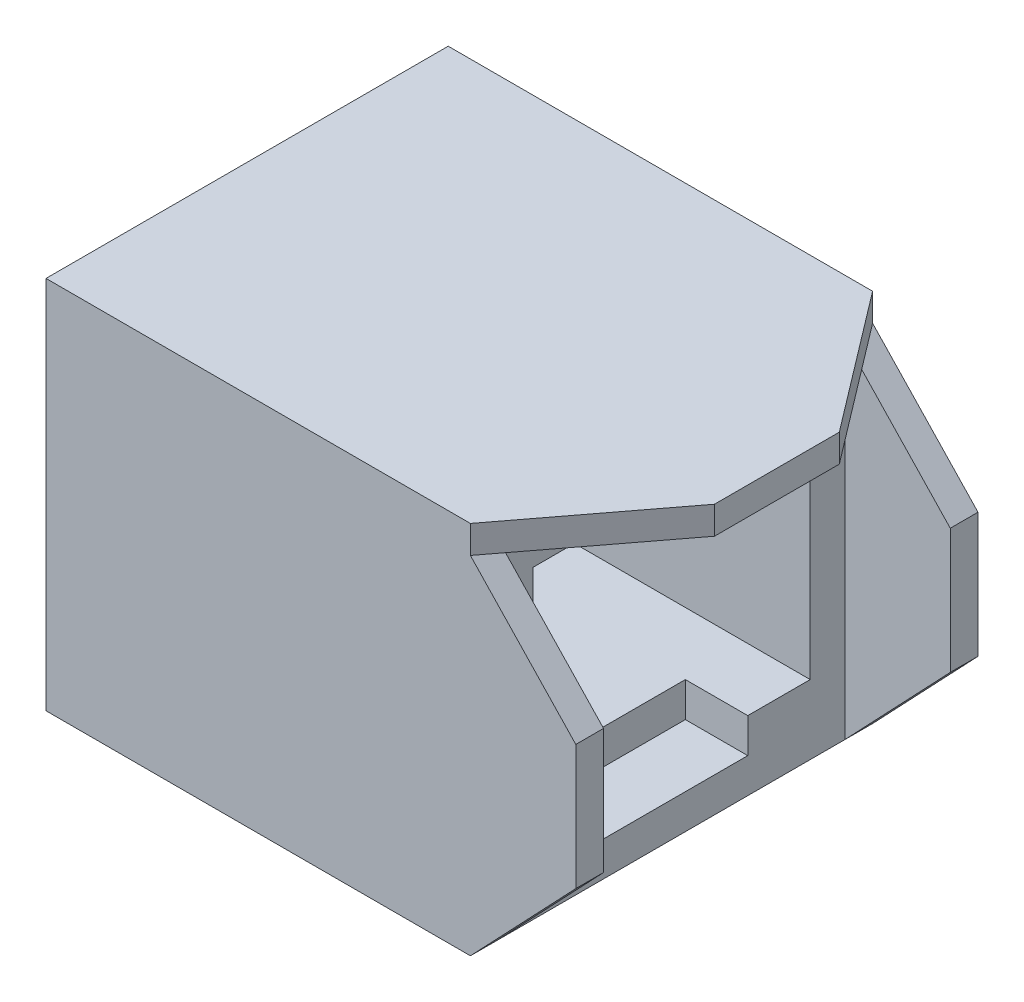
ISO-10303-21;
HEADER;
FILE_DESCRIPTION(('STEP AP214'),'2;1');
FILE_NAME('part.step','',(''),(''),'','','');
FILE_SCHEMA(('AUTOMOTIVE_DESIGN { 1 0 10303 214 1 1 1 1 }'));
ENDSEC;
DATA;
#1=APPLICATION_CONTEXT('core data for automotive mechanical design processes');
#2=APPLICATION_PROTOCOL_DEFINITION('international standard','automotive_design',2000,#1);
#3=PRODUCT_CONTEXT('',#1,'mechanical');
#4=PRODUCT('Part','Part','',(#3));
#5=PRODUCT_RELATED_PRODUCT_CATEGORY('part','',(#4));
#6=PRODUCT_DEFINITION_FORMATION('','',#4);
#7=PRODUCT_DEFINITION_CONTEXT('part definition',#1,'design');
#8=PRODUCT_DEFINITION('design','',#6,#7);
#9=PRODUCT_DEFINITION_SHAPE('','',#8);
#10=(LENGTH_UNIT() NAMED_UNIT(*) SI_UNIT(.MILLI.,.METRE.));
#11=(NAMED_UNIT(*) PLANE_ANGLE_UNIT() SI_UNIT($,.RADIAN.));
#12=(NAMED_UNIT(*) SI_UNIT($,.STERADIAN.) SOLID_ANGLE_UNIT());
#13=UNCERTAINTY_MEASURE_WITH_UNIT(LENGTH_MEASURE(1.E-05),#10,'distance_accuracy_value','');
#14=(GEOMETRIC_REPRESENTATION_CONTEXT(3) GLOBAL_UNCERTAINTY_ASSIGNED_CONTEXT((#13)) GLOBAL_UNIT_ASSIGNED_CONTEXT((#10,
#11,#12)) REPRESENTATION_CONTEXT('',''));
#15=CARTESIAN_POINT('',(0.,0.,0.));
#16=DIRECTION('',(0.,0.,1.));
#17=DIRECTION('',(1.,0.,0.));
#18=AXIS2_PLACEMENT_3D('',#15,#16,#17);
#19=CARTESIAN_POINT('',(28.6,0.,0.));
#20=DIRECTION('',(-1.,0.,0.));
#21=DIRECTION('',(0.,0.,1.));
#22=AXIS2_PLACEMENT_3D('',#19,#20,#21);
#23=PLANE('',#22);
#24=DIRECTION('',(0.,-1.,0.));
#25=VECTOR('',#24,1.);
#26=CARTESIAN_POINT('',(28.6,12.5,-12.5));
#27=LINE('',#26,#25);
#28=CARTESIAN_POINT('',(28.6,12.5,-12.5));
#29=VERTEX_POINT('',#28);
#30=CARTESIAN_POINT('',(28.6,-12.5,-12.5));
#31=VERTEX_POINT('',#30);
#32=EDGE_CURVE('E505',#29,#31,#27,.T.);
#33=ORIENTED_EDGE('',*,*,#32,.F.);
#34=DIRECTION('',(0.,0.,1.));
#35=VECTOR('',#34,1.);
#36=CARTESIAN_POINT('',(28.6,12.5,-12.5));
#37=LINE('',#36,#35);
#38=CARTESIAN_POINT('',(28.6,12.5,12.5));
#39=VERTEX_POINT('',#38);
#40=EDGE_CURVE('E514',#29,#39,#37,.T.);
#41=ORIENTED_EDGE('',*,*,#40,.T.);
#42=DIRECTION('',(0.,-1.,0.));
#43=VECTOR('',#42,1.);
#44=CARTESIAN_POINT('',(28.6,12.5,12.5));
#45=LINE('',#44,#43);
#46=CARTESIAN_POINT('',(28.6,-12.5,12.5));
#47=VERTEX_POINT('',#46);
#48=EDGE_CURVE('E511',#39,#47,#45,.T.);
#49=ORIENTED_EDGE('',*,*,#48,.T.);
#50=DIRECTION('',(0.,0.,1.));
#51=VECTOR('',#50,1.);
#52=CARTESIAN_POINT('',(28.6,-12.5,-12.5));
#53=LINE('',#52,#51);
#54=EDGE_CURVE('E508',#31,#47,#53,.T.);
#55=ORIENTED_EDGE('',*,*,#54,.F.);
#56=EDGE_LOOP('',(#33,#41,#49,#55));
#57=FACE_BOUND('',#56,.T.);
#58=DIRECTION('',(0.,-1.,0.));
#59=VECTOR('',#58,1.);
#60=CARTESIAN_POINT('',(28.6,0.,-5.49999999999999));
#61=LINE('',#60,#59);
#62=CARTESIAN_POINT('',(28.6,-7.5,-5.5));
#63=VERTEX_POINT('',#62);
#64=CARTESIAN_POINT('',(28.6,-10.,-5.5));
#65=VERTEX_POINT('',#64);
#66=EDGE_CURVE('E974',#63,#65,#61,.T.);
#67=ORIENTED_EDGE('',*,*,#66,.T.);
#68=DIRECTION('',(0.,0.,-1.));
#69=VECTOR('',#68,1.);
#70=CARTESIAN_POINT('',(28.6,-10.,0.));
#71=LINE('',#70,#69);
#72=CARTESIAN_POINT('',(28.6,-10.,5.5));
#73=VERTEX_POINT('',#72);
#74=EDGE_CURVE('E973',#73,#65,#71,.T.);
#75=ORIENTED_EDGE('',*,*,#74,.F.);
#76=DIRECTION('',(0.,-1.,0.));
#77=VECTOR('',#76,1.);
#78=CARTESIAN_POINT('',(28.6,0.,5.5));
#79=LINE('',#78,#77);
#80=CARTESIAN_POINT('',(28.6,-7.5,5.5));
#81=VERTEX_POINT('',#80);
#82=EDGE_CURVE('E971',#81,#73,#79,.T.);
#83=ORIENTED_EDGE('',*,*,#82,.F.);
#84=DIRECTION('',(0.,0.,-1.));
#85=VECTOR('',#84,1.);
#86=CARTESIAN_POINT('',(28.6,-7.5,10.));
#87=LINE('',#86,#85);
#88=CARTESIAN_POINT('',(28.6,-7.5,10.));
#89=VERTEX_POINT('',#88);
#90=EDGE_CURVE('E325',#89,#81,#87,.T.);
#91=ORIENTED_EDGE('',*,*,#90,.F.);
#92=DIRECTION('',(0.,-1.,0.));
#93=VECTOR('',#92,1.);
#94=CARTESIAN_POINT('',(28.6,9.5,10.));
#95=LINE('',#94,#93);
#96=CARTESIAN_POINT('',(28.6,9.5,10.));
#97=VERTEX_POINT('',#96);
#98=EDGE_CURVE('E482',#97,#89,#95,.T.);
#99=ORIENTED_EDGE('',*,*,#98,.F.);
#100=DIRECTION('',(0.,0.,-1.));
#101=VECTOR('',#100,1.);
#102=CARTESIAN_POINT('',(28.6,9.5,10.));
#103=LINE('',#102,#101);
#104=CARTESIAN_POINT('',(28.5999999999831,9.5000000000014,2.));
#105=VERTEX_POINT('',#104);
#106=EDGE_CURVE('E490',#97,#105,#103,.T.);
#107=ORIENTED_EDGE('',*,*,#106,.T.);
#108=DIRECTION('',(0.,1.,0.));
#109=VECTOR('',#108,1.);
#110=CARTESIAN_POINT('',(28.6,0.,2.));
#111=LINE('',#110,#109);
#112=CARTESIAN_POINT('',(28.5999999999831,10.5000000000055,2.));
#113=VERTEX_POINT('',#112);
#114=EDGE_CURVE('E362',#105,#113,#111,.T.);
#115=ORIENTED_EDGE('',*,*,#114,.T.);
#116=DIRECTION('',(0.,0.,1.));
#117=VECTOR('',#116,1.);
#118=CARTESIAN_POINT('',(28.6,10.5000000000055,0.));
#119=LINE('',#118,#117);
#120=CARTESIAN_POINT('',(28.5999999999831,10.5000000000055,-2.));
#121=VERTEX_POINT('',#120);
#122=EDGE_CURVE('E365',#121,#113,#119,.T.);
#123=ORIENTED_EDGE('',*,*,#122,.F.);
#124=DIRECTION('',(0.,1.,0.));
#125=VECTOR('',#124,1.);
#126=CARTESIAN_POINT('',(28.6,0.,-2.));
#127=LINE('',#126,#125);
#128=CARTESIAN_POINT('',(28.5999999999831,9.5000000000014,-2.));
#129=VERTEX_POINT('',#128);
#130=EDGE_CURVE('E360',#129,#121,#127,.T.);
#131=ORIENTED_EDGE('',*,*,#130,.F.);
#132=CARTESIAN_POINT('',(28.6,9.5,-10.));
#133=VERTEX_POINT('',#132);
#134=EDGE_CURVE('E489',#129,#133,#103,.T.);
#135=ORIENTED_EDGE('',*,*,#134,.T.);
#136=DIRECTION('',(0.,-1.,0.));
#137=VECTOR('',#136,1.);
#138=CARTESIAN_POINT('',(28.6,9.5,-10.));
#139=LINE('',#138,#137);
#140=CARTESIAN_POINT('',(28.6,-7.5,-10.));
#141=VERTEX_POINT('',#140);
#142=EDGE_CURVE('E486',#133,#141,#139,.T.);
#143=ORIENTED_EDGE('',*,*,#142,.T.);
#144=EDGE_CURVE('E484',#63,#141,#87,.T.);
#145=ORIENTED_EDGE('',*,*,#144,.F.);
#146=EDGE_LOOP('',(#67,#75,#83,#91,#99,#107,#115,#123,#131,#135,#143,#145));
#147=FACE_BOUND('',#146,.T.);
#148=ADVANCED_FACE('F108',(#57,#147),#23,.F.);
#149=CARTESIAN_POINT('',(28.6,-7.5,10.));
#150=DIRECTION('',(0.,1.,0.));
#151=DIRECTION('',(0.,0.,1.));
#152=AXIS2_PLACEMENT_3D('',#149,#150,#151);
#153=PLANE('',#152);
#154=DIRECTION('',(0.,0.,1.));
#155=VECTOR('',#154,1.);
#156=CARTESIAN_POINT('',(24.1,-7.5,0.));
#157=LINE('',#156,#155);
#158=CARTESIAN_POINT('',(24.1,-7.5,-5.5));
#159=VERTEX_POINT('',#158);
#160=CARTESIAN_POINT('',(24.1,-7.5,5.5));
#161=VERTEX_POINT('',#160);
#162=EDGE_CURVE('E314',#159,#161,#157,.T.);
#163=ORIENTED_EDGE('',*,*,#162,.F.);
#164=DIRECTION('',(1.,0.,0.));
#165=VECTOR('',#164,1.);
#166=CARTESIAN_POINT('',(24.1,-7.5,-5.5));
#167=LINE('',#166,#165);
#168=EDGE_CURVE('E326',#159,#63,#167,.T.);
#169=ORIENTED_EDGE('',*,*,#168,.T.);
#170=ORIENTED_EDGE('',*,*,#144,.T.);
#171=DIRECTION('',(-1.,0.,0.));
#172=VECTOR('',#171,1.);
#173=CARTESIAN_POINT('',(28.6,-7.5,-10.));
#174=LINE('',#173,#172);
#175=CARTESIAN_POINT('',(1.1,-7.5,-10.));
#176=VERTEX_POINT('',#175);
#177=EDGE_CURVE('E499',#141,#176,#174,.T.);
#178=ORIENTED_EDGE('',*,*,#177,.T.);
#179=DIRECTION('',(0.,0.,-1.));
#180=VECTOR('',#179,1.);
#181=CARTESIAN_POINT('',(1.1,-7.5,10.));
#182=LINE('',#181,#180);
#183=CARTESIAN_POINT('',(1.1,-7.5,10.));
#184=VERTEX_POINT('',#183);
#185=EDGE_CURVE('E463',#184,#176,#182,.T.);
#186=ORIENTED_EDGE('',*,*,#185,.F.);
#187=DIRECTION('',(-1.,0.,0.));
#188=VECTOR('',#187,1.);
#189=CARTESIAN_POINT('',(28.6,-7.5,10.));
#190=LINE('',#189,#188);
#191=EDGE_CURVE('E502',#89,#184,#190,.T.);
#192=ORIENTED_EDGE('',*,*,#191,.F.);
#193=ORIENTED_EDGE('',*,*,#90,.T.);
#194=DIRECTION('',(1.,0.,0.));
#195=VECTOR('',#194,1.);
#196=CARTESIAN_POINT('',(24.1,-7.5,5.5));
#197=LINE('',#196,#195);
#198=EDGE_CURVE('E309',#161,#81,#197,.T.);
#199=ORIENTED_EDGE('',*,*,#198,.F.);
#200=EDGE_LOOP('',(#163,#169,#170,#178,#186,#192,#193,#199));
#201=FACE_BOUND('',#200,.T.);
#202=ADVANCED_FACE('F322',(#201),#153,.T.);
#203=CARTESIAN_POINT('',(28.6,9.5,10.));
#204=DIRECTION('',(0.,1.,0.));
#205=DIRECTION('',(0.,0.,1.));
#206=AXIS2_PLACEMENT_3D('',#203,#204,#205);
#207=PLANE('',#206);
#208=DIRECTION('',(1.,0.,0.));
#209=VECTOR('',#208,1.);
#210=CARTESIAN_POINT('',(-399982.9,9.49999999994589,-2.));
#211=LINE('',#210,#209);
#212=CARTESIAN_POINT('',(1.10000000000809,9.50000000000139,-2.));
#213=VERTEX_POINT('',#212);
#214=EDGE_CURVE('E339',#213,#129,#211,.T.);
#215=ORIENTED_EDGE('',*,*,#214,.F.);
#216=DIRECTION('',(0.,0.,-1.));
#217=VECTOR('',#216,1.);
#218=CARTESIAN_POINT('',(1.1,9.5,10.));
#219=LINE('',#218,#217);
#220=CARTESIAN_POINT('',(1.1,9.5,-10.));
#221=VERTEX_POINT('',#220);
#222=EDGE_CURVE('E468',#213,#221,#219,.T.);
#223=ORIENTED_EDGE('',*,*,#222,.T.);
#224=DIRECTION('',(-1.,0.,0.));
#225=VECTOR('',#224,1.);
#226=CARTESIAN_POINT('',(28.6,9.5,-10.));
#227=LINE('',#226,#225);
#228=EDGE_CURVE('E496',#133,#221,#227,.T.);
#229=ORIENTED_EDGE('',*,*,#228,.F.);
#230=ORIENTED_EDGE('',*,*,#134,.F.);
#231=EDGE_LOOP('',(#215,#223,#229,#230));
#232=FACE_BOUND('',#231,.T.);
#233=ADVANCED_FACE('F614',(#232),#207,.F.);
#234=CARTESIAN_POINT('',(36.2,0.,0.));
#235=DIRECTION('',(-1.,0.,0.));
#236=DIRECTION('',(0.,0.,1.));
#237=AXIS2_PLACEMENT_3D('',#234,#235,#236);
#238=PLANE('',#237);
#239=DIRECTION('',(0.,-1.,0.));
#240=VECTOR('',#239,1.);
#241=CARTESIAN_POINT('',(36.2,14.5,14.5));
#242=LINE('',#241,#240);
#243=CARTESIAN_POINT('',(36.2,4.5,14.5));
#244=VERTEX_POINT('',#243);
#245=CARTESIAN_POINT('',(36.2,-4.5,14.5));
#246=VERTEX_POINT('',#245);
#247=EDGE_CURVE('E529',#244,#246,#242,.T.);
#248=ORIENTED_EDGE('',*,*,#247,.T.);
#249=DIRECTION('',(0.,0.,1.));
#250=VECTOR('',#249,1.);
#251=CARTESIAN_POINT('',(36.2,-4.5,-14.5));
#252=LINE('',#251,#250);
#253=CARTESIAN_POINT('',(36.2,-4.5,12.5));
#254=VERTEX_POINT('',#253);
#255=EDGE_CURVE('E395',#254,#246,#252,.T.);
#256=ORIENTED_EDGE('',*,*,#255,.F.);
#257=DIRECTION('',(0.,-1.,0.));
#258=VECTOR('',#257,1.);
#259=CARTESIAN_POINT('',(36.2,12.5,12.5));
#260=LINE('',#259,#258);
#261=CARTESIAN_POINT('',(36.2,4.5,12.5));
#262=VERTEX_POINT('',#261);
#263=EDGE_CURVE('E520',#262,#254,#260,.T.);
#264=ORIENTED_EDGE('',*,*,#263,.F.);
#265=DIRECTION('',(0.,0.,1.));
#266=VECTOR('',#265,1.);
#267=CARTESIAN_POINT('',(36.2,4.5,-14.5));
#268=LINE('',#267,#266);
#269=EDGE_CURVE('E418',#262,#244,#268,.T.);
#270=ORIENTED_EDGE('',*,*,#269,.T.);
#271=EDGE_LOOP('',(#248,#256,#264,#270));
#272=FACE_BOUND('',#271,.T.);
#273=ADVANCED_FACE('F563',(#272),#238,.F.);
#274=DIRECTION('',(0.,-1.,0.));
#275=VECTOR('',#274,1.);
#276=CARTESIAN_POINT('',(36.2,12.5,-12.5));
#277=LINE('',#276,#275);
#278=CARTESIAN_POINT('',(36.2,4.5,-12.5));
#279=VERTEX_POINT('',#278);
#280=CARTESIAN_POINT('',(36.2,-4.5,-12.5));
#281=VERTEX_POINT('',#280);
#282=EDGE_CURVE('E517',#279,#281,#277,.T.);
#283=ORIENTED_EDGE('',*,*,#282,.T.);
#284=CARTESIAN_POINT('',(36.2,-4.5,-14.5));
#285=VERTEX_POINT('',#284);
#286=EDGE_CURVE('E409',#285,#281,#252,.T.);
#287=ORIENTED_EDGE('',*,*,#286,.F.);
#288=DIRECTION('',(0.,-1.,0.));
#289=VECTOR('',#288,1.);
#290=CARTESIAN_POINT('',(36.2,14.5,-14.5));
#291=LINE('',#290,#289);
#292=CARTESIAN_POINT('',(36.2,4.5,-14.5));
#293=VERTEX_POINT('',#292);
#294=EDGE_CURVE('E526',#293,#285,#291,.T.);
#295=ORIENTED_EDGE('',*,*,#294,.F.);
#296=EDGE_CURVE('E399',#293,#279,#268,.T.);
#297=ORIENTED_EDGE('',*,*,#296,.T.);
#298=EDGE_LOOP('',(#283,#287,#295,#297));
#299=FACE_BOUND('',#298,.T.);
#300=ADVANCED_FACE('F593',(#299),#238,.F.);
#301=CARTESIAN_POINT('',(36.2,12.5,-12.5));
#302=DIRECTION('',(0.,0.,-1.));
#303=DIRECTION('',(-1.,0.,0.));
#304=AXIS2_PLACEMENT_3D('',#301,#302,#303);
#305=PLANE('',#304);
#306=ORIENTED_EDGE('',*,*,#32,.T.);
#307=DIRECTION('',(0.688749461914693,0.724999433594414,0.));
#308=VECTOR('',#307,1.);
#309=CARTESIAN_POINT('',(44.6888304862024,4.43561103810776,-12.5));
#310=LINE('',#309,#308);
#311=EDGE_CURVE('E427',#31,#281,#310,.T.);
#312=ORIENTED_EDGE('',*,*,#311,.T.);
#313=ORIENTED_EDGE('',*,*,#282,.F.);
#314=DIRECTION('',(-0.688749461914693,0.724999433594414,0.));
#315=VECTOR('',#314,1.);
#316=CARTESIAN_POINT('',(32.2052562417871,8.70499342969776,-12.5));
#317=LINE('',#316,#315);
#318=EDGE_CURVE('E422',#279,#29,#317,.T.);
#319=ORIENTED_EDGE('',*,*,#318,.T.);
#320=EDGE_LOOP('',(#306,#312,#313,#319));
#321=FACE_BOUND('',#320,.T.);
#322=ADVANCED_FACE('F598',(#321),#305,.F.);
#323=CARTESIAN_POINT('',(36.2,12.5,-12.5));
#324=DIRECTION('',(0.,-1.,0.));
#325=DIRECTION('',(0.,0.,-1.));
#326=AXIS2_PLACEMENT_3D('',#323,#324,#325);
#327=PLANE('',#326);
#328=DIRECTION('',(0.605083267533558,0.,0.796162194123103));
#329=VECTOR('',#328,1.);
#330=CARTESIAN_POINT('',(36.2,12.5,-4.5));
#331=LINE('',#330,#329);
#332=CARTESIAN_POINT('',(28.6,12.5,-14.5));
#333=VERTEX_POINT('',#332);
#334=CARTESIAN_POINT('',(36.2,12.5,-4.5));
#335=VERTEX_POINT('',#334);
#336=EDGE_CURVE('E372',#333,#335,#331,.T.);
#337=ORIENTED_EDGE('',*,*,#336,.T.);
#338=DIRECTION('',(0.,0.,1.));
#339=VECTOR('',#338,1.);
#340=CARTESIAN_POINT('',(36.2,12.5,-12.5));
#341=LINE('',#340,#339);
#342=CARTESIAN_POINT('',(36.2,12.5,4.5));
#343=VERTEX_POINT('',#342);
#344=EDGE_CURVE('E523',#335,#343,#341,.T.);
#345=ORIENTED_EDGE('',*,*,#344,.T.);
#346=DIRECTION('',(-0.605083267533558,0.,0.796162194123103));
#347=VECTOR('',#346,1.);
#348=CARTESIAN_POINT('',(36.2,12.5,4.5));
#349=LINE('',#348,#347);
#350=CARTESIAN_POINT('',(28.6,12.5,14.5));
#351=VERTEX_POINT('',#350);
#352=EDGE_CURVE('E367',#343,#351,#349,.T.);
#353=ORIENTED_EDGE('',*,*,#352,.T.);
#354=DIRECTION('',(0.,0.,1.));
#355=VECTOR('',#354,1.);
#356=CARTESIAN_POINT('',(28.6,12.5,-14.5));
#357=LINE('',#356,#355);
#358=EDGE_CURVE('E414',#39,#351,#357,.T.);
#359=ORIENTED_EDGE('',*,*,#358,.F.);
#360=ORIENTED_EDGE('',*,*,#40,.F.);
#361=EDGE_CURVE('E419',#333,#29,#357,.T.);
#362=ORIENTED_EDGE('',*,*,#361,.F.);
#363=EDGE_LOOP('',(#337,#345,#353,#359,#360,#362));
#364=FACE_BOUND('',#363,.T.);
#365=ADVANCED_FACE('F581',(#364),#327,.T.);
#366=CARTESIAN_POINT('',(36.2,12.5,12.5));
#367=DIRECTION('',(0.,0.,-1.));
#368=DIRECTION('',(-1.,0.,0.));
#369=AXIS2_PLACEMENT_3D('',#366,#367,#368);
#370=PLANE('',#369);
#371=DIRECTION('',(0.688749461914693,0.724999433594414,0.));
#372=VECTOR('',#371,1.);
#373=CARTESIAN_POINT('',(44.6888304862024,4.43561103810776,12.5));
#374=LINE('',#373,#372);
#375=EDGE_CURVE('E425',#47,#254,#374,.T.);
#376=ORIENTED_EDGE('',*,*,#375,.F.);
#377=ORIENTED_EDGE('',*,*,#48,.F.);
#378=DIRECTION('',(-0.688749461914693,0.724999433594414,0.));
#379=VECTOR('',#378,1.);
#380=CARTESIAN_POINT('',(32.2052562417871,8.70499342969776,12.5));
#381=LINE('',#380,#379);
#382=EDGE_CURVE('E404',#262,#39,#381,.T.);
#383=ORIENTED_EDGE('',*,*,#382,.F.);
#384=ORIENTED_EDGE('',*,*,#263,.T.);
#385=EDGE_LOOP('',(#376,#377,#383,#384));
#386=FACE_BOUND('',#385,.T.);
#387=ADVANCED_FACE('F573',(#386),#370,.T.);
#388=CARTESIAN_POINT('',(36.2,14.5,-14.5));
#389=DIRECTION('',(0.,0.,-1.));
#390=DIRECTION('',(-1.,0.,0.));
#391=AXIS2_PLACEMENT_3D('',#388,#389,#390);
#392=PLANE('',#391);
#393=DIRECTION('',(0.,1.,0.));
#394=VECTOR('',#393,1.);
#395=CARTESIAN_POINT('',(28.6,-12.501,-14.5));
#396=LINE('',#395,#394);
#397=CARTESIAN_POINT('',(28.6,14.5,-14.5));
#398=VERTEX_POINT('',#397);
#399=EDGE_CURVE('E371',#333,#398,#396,.T.);
#400=ORIENTED_EDGE('',*,*,#399,.F.);
#401=DIRECTION('',(0.688749461914693,-0.724999433594414,0.));
#402=VECTOR('',#401,1.);
#403=CARTESIAN_POINT('',(28.6,12.5,-14.5));
#404=LINE('',#403,#402);
#405=EDGE_CURVE('E411',#333,#293,#404,.T.);
#406=ORIENTED_EDGE('',*,*,#405,.T.);
#407=ORIENTED_EDGE('',*,*,#294,.T.);
#408=DIRECTION('',(-0.688749461914693,-0.724999433594414,0.));
#409=VECTOR('',#408,1.);
#410=CARTESIAN_POINT('',(28.6,-12.5,-14.5));
#411=LINE('',#410,#409);
#412=CARTESIAN_POINT('',(28.6,-12.5,-14.5));
#413=VERTEX_POINT('',#412);
#414=EDGE_CURVE('E388',#285,#413,#411,.T.);
#415=ORIENTED_EDGE('',*,*,#414,.T.);
#416=DIRECTION('',(-1.,0.,0.));
#417=VECTOR('',#416,1.);
#418=CARTESIAN_POINT('',(-2.,-12.5,-14.5));
#419=LINE('',#418,#417);
#420=CARTESIAN_POINT('',(-2.,-12.5,-14.5));
#421=VERTEX_POINT('',#420);
#422=EDGE_CURVE('E391',#413,#421,#419,.T.);
#423=ORIENTED_EDGE('',*,*,#422,.T.);
#424=DIRECTION('',(0.,-1.,0.));
#425=VECTOR('',#424,1.);
#426=CARTESIAN_POINT('',(-2.,14.5,-14.5));
#427=LINE('',#426,#425);
#428=CARTESIAN_POINT('',(-2.,14.5,-14.5));
#429=VERTEX_POINT('',#428);
#430=EDGE_CURVE('E479',#429,#421,#427,.T.);
#431=ORIENTED_EDGE('',*,*,#430,.F.);
#432=DIRECTION('',(-1.,0.,0.));
#433=VECTOR('',#432,1.);
#434=CARTESIAN_POINT('',(36.2,14.5,-14.5));
#435=LINE('',#434,#433);
#436=EDGE_CURVE('E12',#398,#429,#435,.T.);
#437=ORIENTED_EDGE('',*,*,#436,.F.);
#438=EDGE_LOOP('',(#400,#406,#407,#415,#423,#431,#437));
#439=FACE_BOUND('',#438,.T.);
#440=ADVANCED_FACE('F110',(#439),#392,.T.);
#441=CARTESIAN_POINT('',(36.2,14.5,-14.5));
#442=DIRECTION('',(0.,-1.,0.));
#443=DIRECTION('',(0.,0.,-1.));
#444=AXIS2_PLACEMENT_3D('',#441,#442,#443);
#445=PLANE('',#444);
#446=DIRECTION('',(0.,0.,1.));
#447=VECTOR('',#446,1.);
#448=CARTESIAN_POINT('',(36.2,14.5,-14.5));
#449=LINE('',#448,#447);
#450=CARTESIAN_POINT('',(36.2,14.5,-4.5));
#451=VERTEX_POINT('',#450);
#452=CARTESIAN_POINT('',(36.2,14.5,4.5));
#453=VERTEX_POINT('',#452);
#454=EDGE_CURVE('E532',#451,#453,#449,.T.);
#455=ORIENTED_EDGE('',*,*,#454,.F.);
#456=DIRECTION('',(0.605083267533558,0.,0.796162194123102));
#457=VECTOR('',#456,1.);
#458=CARTESIAN_POINT('',(36.2,14.5,-4.5));
#459=LINE('',#458,#457);
#460=EDGE_CURVE('E373',#398,#451,#459,.T.);
#461=ORIENTED_EDGE('',*,*,#460,.F.);
#462=ORIENTED_EDGE('',*,*,#436,.T.);
#463=DIRECTION('',(0.,0.,1.));
#464=VECTOR('',#463,1.);
#465=CARTESIAN_POINT('',(-2.,14.5,-14.5));
#466=LINE('',#465,#464);
#467=CARTESIAN_POINT('',(-2.,14.5,14.5));
#468=VERTEX_POINT('',#467);
#469=EDGE_CURVE('E472',#429,#468,#466,.T.);
#470=ORIENTED_EDGE('',*,*,#469,.T.);
#471=DIRECTION('',(-1.,0.,0.));
#472=VECTOR('',#471,1.);
#473=CARTESIAN_POINT('',(36.2,14.5,14.5));
#474=LINE('',#473,#472);
#475=CARTESIAN_POINT('',(28.6,14.5,14.5));
#476=VERTEX_POINT('',#475);
#477=EDGE_CURVE('E112',#476,#468,#474,.T.);
#478=ORIENTED_EDGE('',*,*,#477,.F.);
#479=DIRECTION('',(-0.605083267533558,0.,0.796162194123102));
#480=VECTOR('',#479,1.);
#481=CARTESIAN_POINT('',(36.2,14.5,4.5));
#482=LINE('',#481,#480);
#483=EDGE_CURVE('E378',#453,#476,#482,.T.);
#484=ORIENTED_EDGE('',*,*,#483,.F.);
#485=EDGE_LOOP('',(#455,#461,#462,#470,#478,#484));
#486=FACE_BOUND('',#485,.T.);
#487=ADVANCED_FACE('F548',(#486),#445,.F.);
#488=CARTESIAN_POINT('',(36.2,14.5,14.5));
#489=DIRECTION('',(0.,0.,-1.));
#490=DIRECTION('',(-1.,0.,0.));
#491=AXIS2_PLACEMENT_3D('',#488,#489,#490);
#492=PLANE('',#491);
#493=DIRECTION('',(0.688749461914693,-0.724999433594414,0.));
#494=VECTOR('',#493,1.);
#495=CARTESIAN_POINT('',(28.6,12.5,14.5));
#496=LINE('',#495,#494);
#497=EDGE_CURVE('E375',#351,#244,#496,.T.);
#498=ORIENTED_EDGE('',*,*,#497,.F.);
#499=DIRECTION('',(0.,1.,0.));
#500=VECTOR('',#499,1.);
#501=CARTESIAN_POINT('',(28.6,-12.501,14.5));
#502=LINE('',#501,#500);
#503=EDGE_CURVE('E382',#351,#476,#502,.T.);
#504=ORIENTED_EDGE('',*,*,#503,.T.);
#505=ORIENTED_EDGE('',*,*,#477,.T.);
#506=DIRECTION('',(0.,-1.,0.));
#507=VECTOR('',#506,1.);
#508=CARTESIAN_POINT('',(-2.,14.5,14.5));
#509=LINE('',#508,#507);
#510=CARTESIAN_POINT('',(-2.,-12.5,14.5));
#511=VERTEX_POINT('',#510);
#512=EDGE_CURVE('E476',#468,#511,#509,.T.);
#513=ORIENTED_EDGE('',*,*,#512,.T.);
#514=DIRECTION('',(-1.,0.,0.));
#515=VECTOR('',#514,1.);
#516=CARTESIAN_POINT('',(-2.,-12.5,14.5));
#517=LINE('',#516,#515);
#518=CARTESIAN_POINT('',(28.6,-12.5,14.5));
#519=VERTEX_POINT('',#518);
#520=EDGE_CURVE('E392',#519,#511,#517,.T.);
#521=ORIENTED_EDGE('',*,*,#520,.F.);
#522=DIRECTION('',(-0.688749461914693,-0.724999433594414,0.));
#523=VECTOR('',#522,1.);
#524=CARTESIAN_POINT('',(28.6,-12.5,14.5));
#525=LINE('',#524,#523);
#526=EDGE_CURVE('E396',#246,#519,#525,.T.);
#527=ORIENTED_EDGE('',*,*,#526,.F.);
#528=ORIENTED_EDGE('',*,*,#247,.F.);
#529=EDGE_LOOP('',(#498,#504,#505,#513,#521,#527,#528));
#530=FACE_BOUND('',#529,.T.);
#531=ADVANCED_FACE('F541',(#530),#492,.F.);
#532=ORIENTED_EDGE('',*,*,#344,.F.);
#533=DIRECTION('',(0.,1.,0.));
#534=VECTOR('',#533,1.);
#535=CARTESIAN_POINT('',(36.2,-12.501,-4.5));
#536=LINE('',#535,#534);
#537=EDGE_CURVE('E368',#335,#451,#536,.T.);
#538=ORIENTED_EDGE('',*,*,#537,.T.);
#539=ORIENTED_EDGE('',*,*,#454,.T.);
#540=DIRECTION('',(0.,1.,0.));
#541=VECTOR('',#540,1.);
#542=CARTESIAN_POINT('',(36.2,-12.501,4.5));
#543=LINE('',#542,#541);
#544=EDGE_CURVE('E380',#343,#453,#543,.T.);
#545=ORIENTED_EDGE('',*,*,#544,.F.);
#546=EDGE_LOOP('',(#532,#538,#539,#545));
#547=FACE_BOUND('',#546,.T.);
#548=ADVANCED_FACE('F586',(#547),#238,.F.);
#549=CARTESIAN_POINT('',(28.6,9.5,10.));
#550=DIRECTION('',(0.,0.,-1.));
#551=DIRECTION('',(-1.,0.,0.));
#552=AXIS2_PLACEMENT_3D('',#549,#550,#551);
#553=PLANE('',#552);
#554=DIRECTION('',(0.,-1.,0.));
#555=VECTOR('',#554,1.);
#556=CARTESIAN_POINT('',(1.1,9.5,10.));
#557=LINE('',#556,#555);
#558=CARTESIAN_POINT('',(1.1,9.5,10.));
#559=VERTEX_POINT('',#558);
#560=EDGE_CURVE('E456',#559,#184,#557,.T.);
#561=ORIENTED_EDGE('',*,*,#560,.F.);
#562=DIRECTION('',(-1.,0.,0.));
#563=VECTOR('',#562,1.);
#564=CARTESIAN_POINT('',(28.6,9.5,10.));
#565=LINE('',#564,#563);
#566=EDGE_CURVE('E493',#97,#559,#565,.T.);
#567=ORIENTED_EDGE('',*,*,#566,.F.);
#568=ORIENTED_EDGE('',*,*,#98,.T.);
#569=ORIENTED_EDGE('',*,*,#191,.T.);
#570=EDGE_LOOP('',(#561,#567,#568,#569));
#571=FACE_BOUND('',#570,.T.);
#572=ADVANCED_FACE('F618',(#571),#553,.T.);
#573=CARTESIAN_POINT('',(28.6,9.5,-10.));
#574=DIRECTION('',(0.,0.,-1.));
#575=DIRECTION('',(-1.,0.,0.));
#576=AXIS2_PLACEMENT_3D('',#573,#574,#575);
#577=PLANE('',#576);
#578=ORIENTED_EDGE('',*,*,#228,.T.);
#579=DIRECTION('',(0.,-1.,0.));
#580=VECTOR('',#579,1.);
#581=CARTESIAN_POINT('',(1.1,9.5,-10.));
#582=LINE('',#581,#580);
#583=EDGE_CURVE('E465',#221,#176,#582,.T.);
#584=ORIENTED_EDGE('',*,*,#583,.T.);
#585=ORIENTED_EDGE('',*,*,#177,.F.);
#586=ORIENTED_EDGE('',*,*,#142,.F.);
#587=EDGE_LOOP('',(#578,#584,#585,#586));
#588=FACE_BOUND('',#587,.T.);
#589=ADVANCED_FACE('F644',(#588),#577,.F.);
#590=CARTESIAN_POINT('',(1.1,9.5,2.));
#591=VERTEX_POINT('',#590);
#592=EDGE_CURVE('E469',#559,#591,#219,.T.);
#593=ORIENTED_EDGE('',*,*,#592,.T.);
#594=DIRECTION('',(1.,0.,0.));
#595=VECTOR('',#594,1.);
#596=CARTESIAN_POINT('',(-399982.9,9.49999999994589,2.));
#597=LINE('',#596,#595);
#598=EDGE_CURVE('E348',#591,#105,#597,.T.);
#599=ORIENTED_EDGE('',*,*,#598,.T.);
#600=ORIENTED_EDGE('',*,*,#106,.F.);
#601=ORIENTED_EDGE('',*,*,#566,.T.);
#602=EDGE_LOOP('',(#593,#599,#600,#601));
#603=FACE_BOUND('',#602,.T.);
#604=ADVANCED_FACE('F651',(#603),#207,.F.);
#605=CARTESIAN_POINT('',(-2.,0.,0.));
#606=DIRECTION('',(1.,0.,0.));
#607=DIRECTION('',(0.,0.,-1.));
#608=AXIS2_PLACEMENT_3D('',#605,#606,#607);
#609=PLANE('',#608);
#610=DIRECTION('',(0.,0.,-1.));
#611=VECTOR('',#610,1.);
#612=CARTESIAN_POINT('',(-2.00000000000955,10.4999999999791,2.));
#613=LINE('',#612,#611);
#614=CARTESIAN_POINT('',(-2.00000000000955,10.4999999999791,2.));
#615=VERTEX_POINT('',#614);
#616=CARTESIAN_POINT('',(-2.,10.5000000000055,-2.));
#617=VERTEX_POINT('',#616);
#618=EDGE_CURVE('E131',#615,#617,#613,.T.);
#619=ORIENTED_EDGE('',*,*,#618,.F.);
#620=DIRECTION('',(0.,-1.,0.));
#621=VECTOR('',#620,1.);
#622=CARTESIAN_POINT('',(-2.00000000000955,-291584.15,2.));
#623=LINE('',#622,#621);
#624=CARTESIAN_POINT('',(-2.00000000000955,9.50000000000273,2.));
#625=VERTEX_POINT('',#624);
#626=EDGE_CURVE('E353',#615,#625,#623,.T.);
#627=ORIENTED_EDGE('',*,*,#626,.T.);
#628=DIRECTION('',(0.,0.,-1.));
#629=VECTOR('',#628,1.);
#630=CARTESIAN_POINT('',(-2.00000000000955,9.50000000000273,2.));
#631=LINE('',#630,#629);
#632=CARTESIAN_POINT('',(-2.00000000000955,9.50000000000273,-2.));
#633=VERTEX_POINT('',#632);
#634=EDGE_CURVE('E356',#625,#633,#631,.T.);
#635=ORIENTED_EDGE('',*,*,#634,.T.);
#636=DIRECTION('',(0.,-1.,0.));
#637=VECTOR('',#636,1.);
#638=CARTESIAN_POINT('',(-2.00000000000955,-291584.15,-2.));
#639=LINE('',#638,#637);
#640=EDGE_CURVE('E345',#617,#633,#639,.T.);
#641=ORIENTED_EDGE('',*,*,#640,.F.);
#642=EDGE_LOOP('',(#619,#627,#635,#641));
#643=FACE_BOUND('',#642,.T.);
#644=ORIENTED_EDGE('',*,*,#430,.T.);
#645=DIRECTION('',(0.,0.,1.));
#646=VECTOR('',#645,1.);
#647=CARTESIAN_POINT('',(-2.,-12.5,-14.5));
#648=LINE('',#647,#646);
#649=EDGE_CURVE('E401',#421,#511,#648,.T.);
#650=ORIENTED_EDGE('',*,*,#649,.T.);
#651=ORIENTED_EDGE('',*,*,#512,.F.);
#652=ORIENTED_EDGE('',*,*,#469,.F.);
#653=EDGE_LOOP('',(#644,#650,#651,#652));
#654=FACE_BOUND('',#653,.T.);
#655=ADVANCED_FACE('F547',(#643,#654),#609,.F.);
#656=CARTESIAN_POINT('',(1.1,0.,0.));
#657=DIRECTION('',(1.,0.,0.));
#658=DIRECTION('',(0.,0.,-1.));
#659=AXIS2_PLACEMENT_3D('',#656,#657,#658);
#660=PLANE('',#659);
#661=DIRECTION('',(0.,1.,0.));
#662=VECTOR('',#661,1.);
#663=CARTESIAN_POINT('',(1.1,-4.,4.));
#664=LINE('',#663,#662);
#665=CARTESIAN_POINT('',(1.1,-4.,4.));
#666=VERTEX_POINT('',#665);
#667=CARTESIAN_POINT('',(1.1,4.,4.));
#668=VERTEX_POINT('',#667);
#669=EDGE_CURVE('E431',#666,#668,#664,.T.);
#670=ORIENTED_EDGE('',*,*,#669,.T.);
#671=DIRECTION('',(0.,0.,-1.));
#672=VECTOR('',#671,1.);
#673=CARTESIAN_POINT('',(1.1,4.,4.));
#674=LINE('',#673,#672);
#675=CARTESIAN_POINT('',(1.1,4.,-4.));
#676=VERTEX_POINT('',#675);
#677=EDGE_CURVE('E434',#668,#676,#674,.T.);
#678=ORIENTED_EDGE('',*,*,#677,.T.);
#679=DIRECTION('',(0.,1.,0.));
#680=VECTOR('',#679,1.);
#681=CARTESIAN_POINT('',(1.1,-4.,-4.));
#682=LINE('',#681,#680);
#683=CARTESIAN_POINT('',(1.1,-4.,-4.));
#684=VERTEX_POINT('',#683);
#685=EDGE_CURVE('E438',#684,#676,#682,.T.);
#686=ORIENTED_EDGE('',*,*,#685,.F.);
#687=DIRECTION('',(0.,0.,-1.));
#688=VECTOR('',#687,1.);
#689=CARTESIAN_POINT('',(1.1,-4.,4.));
#690=LINE('',#689,#688);
#691=EDGE_CURVE('E441',#666,#684,#690,.T.);
#692=ORIENTED_EDGE('',*,*,#691,.F.);
#693=EDGE_LOOP('',(#670,#678,#686,#692));
#694=FACE_BOUND('',#693,.T.);
#695=ORIENTED_EDGE('',*,*,#560,.T.);
#696=ORIENTED_EDGE('',*,*,#185,.T.);
#697=ORIENTED_EDGE('',*,*,#583,.F.);
#698=ORIENTED_EDGE('',*,*,#222,.F.);
#699=EDGE_CURVE('E473',#591,#213,#219,.T.);
#700=ORIENTED_EDGE('',*,*,#699,.F.);
#701=ORIENTED_EDGE('',*,*,#592,.F.);
#702=EDGE_LOOP('',(#695,#696,#697,#698,#700,#701));
#703=FACE_BOUND('',#702,.T.);
#704=ADVANCED_FACE('F668',(#694,#703),#660,.T.);
#705=CARTESIAN_POINT('',(1.1,-4.,4.));
#706=DIRECTION('',(0.,0.,1.));
#707=DIRECTION('',(1.,0.,0.));
#708=AXIS2_PLACEMENT_3D('',#705,#706,#707);
#709=PLANE('',#708);
#710=DIRECTION('',(0.,1.,0.));
#711=VECTOR('',#710,1.);
#712=CARTESIAN_POINT('',(0.,-4.,4.));
#713=LINE('',#712,#711);
#714=CARTESIAN_POINT('',(0.,-4.,4.));
#715=VERTEX_POINT('',#714);
#716=CARTESIAN_POINT('',(0.,4.,4.));
#717=VERTEX_POINT('',#716);
#718=EDGE_CURVE('E430',#715,#717,#713,.T.);
#719=ORIENTED_EDGE('',*,*,#718,.T.);
#720=DIRECTION('',(-1.,0.,0.));
#721=VECTOR('',#720,1.);
#722=CARTESIAN_POINT('',(1.1,4.,4.));
#723=LINE('',#722,#721);
#724=EDGE_CURVE('E443',#668,#717,#723,.T.);
#725=ORIENTED_EDGE('',*,*,#724,.F.);
#726=ORIENTED_EDGE('',*,*,#669,.F.);
#727=DIRECTION('',(-1.,0.,0.));
#728=VECTOR('',#727,1.);
#729=CARTESIAN_POINT('',(1.1,-4.,4.));
#730=LINE('',#729,#728);
#731=EDGE_CURVE('E454',#666,#715,#730,.T.);
#732=ORIENTED_EDGE('',*,*,#731,.T.);
#733=EDGE_LOOP('',(#719,#725,#726,#732));
#734=FACE_BOUND('',#733,.T.);
#735=ADVANCED_FACE('F676',(#734),#709,.F.);
#736=CARTESIAN_POINT('',(1.1,-4.,4.));
#737=DIRECTION('',(0.,1.,0.));
#738=DIRECTION('',(0.,0.,1.));
#739=AXIS2_PLACEMENT_3D('',#736,#737,#738);
#740=PLANE('',#739);
#741=DIRECTION('',(0.,0.,-1.));
#742=VECTOR('',#741,1.);
#743=CARTESIAN_POINT('',(0.,-4.,4.));
#744=LINE('',#743,#742);
#745=CARTESIAN_POINT('',(0.,-4.,-4.));
#746=VERTEX_POINT('',#745);
#747=EDGE_CURVE('E435',#715,#746,#744,.T.);
#748=ORIENTED_EDGE('',*,*,#747,.F.);
#749=ORIENTED_EDGE('',*,*,#731,.F.);
#750=ORIENTED_EDGE('',*,*,#691,.T.);
#751=DIRECTION('',(-1.,0.,0.));
#752=VECTOR('',#751,1.);
#753=CARTESIAN_POINT('',(1.1,-4.,-4.));
#754=LINE('',#753,#752);
#755=EDGE_CURVE('E457',#684,#746,#754,.T.);
#756=ORIENTED_EDGE('',*,*,#755,.T.);
#757=EDGE_LOOP('',(#748,#749,#750,#756));
#758=FACE_BOUND('',#757,.T.);
#759=ADVANCED_FACE('F684',(#758),#740,.T.);
#760=CARTESIAN_POINT('',(1.1,-4.,-4.));
#761=DIRECTION('',(0.,0.,1.));
#762=DIRECTION('',(1.,0.,0.));
#763=AXIS2_PLACEMENT_3D('',#760,#761,#762);
#764=PLANE('',#763);
#765=DIRECTION('',(0.,1.,0.));
#766=VECTOR('',#765,1.);
#767=CARTESIAN_POINT('',(0.,-4.,-4.));
#768=LINE('',#767,#766);
#769=CARTESIAN_POINT('',(0.,4.,-4.));
#770=VERTEX_POINT('',#769);
#771=EDGE_CURVE('E449',#746,#770,#768,.T.);
#772=ORIENTED_EDGE('',*,*,#771,.F.);
#773=ORIENTED_EDGE('',*,*,#755,.F.);
#774=ORIENTED_EDGE('',*,*,#685,.T.);
#775=DIRECTION('',(-1.,0.,0.));
#776=VECTOR('',#775,1.);
#777=CARTESIAN_POINT('',(1.1,4.,-4.));
#778=LINE('',#777,#776);
#779=EDGE_CURVE('E459',#676,#770,#778,.T.);
#780=ORIENTED_EDGE('',*,*,#779,.T.);
#781=EDGE_LOOP('',(#772,#773,#774,#780));
#782=FACE_BOUND('',#781,.T.);
#783=ADVANCED_FACE('F692',(#782),#764,.T.);
#784=CARTESIAN_POINT('',(1.1,4.,4.));
#785=DIRECTION('',(0.,1.,0.));
#786=DIRECTION('',(0.,0.,1.));
#787=AXIS2_PLACEMENT_3D('',#784,#785,#786);
#788=PLANE('',#787);
#789=DIRECTION('',(0.,0.,-1.));
#790=VECTOR('',#789,1.);
#791=CARTESIAN_POINT('',(0.,4.,4.));
#792=LINE('',#791,#790);
#793=EDGE_CURVE('E446',#717,#770,#792,.T.);
#794=ORIENTED_EDGE('',*,*,#793,.T.);
#795=ORIENTED_EDGE('',*,*,#779,.F.);
#796=ORIENTED_EDGE('',*,*,#677,.F.);
#797=ORIENTED_EDGE('',*,*,#724,.T.);
#798=EDGE_LOOP('',(#794,#795,#796,#797));
#799=FACE_BOUND('',#798,.T.);
#800=ADVANCED_FACE('F699',(#799),#788,.F.);
#801=CARTESIAN_POINT('',(0.,0.,0.));
#802=DIRECTION('',(1.,0.,0.));
#803=DIRECTION('',(0.,0.,-1.));
#804=AXIS2_PLACEMENT_3D('',#801,#802,#803);
#805=PLANE('',#804);
#806=ORIENTED_EDGE('',*,*,#793,.F.);
#807=ORIENTED_EDGE('',*,*,#718,.F.);
#808=ORIENTED_EDGE('',*,*,#747,.T.);
#809=ORIENTED_EDGE('',*,*,#771,.T.);
#810=EDGE_LOOP('',(#806,#807,#808,#809));
#811=FACE_BOUND('',#810,.T.);
#812=ADVANCED_FACE('F707',(#811),#805,.T.);
#813=CARTESIAN_POINT('',(28.6,-12.5,-14.5));
#814=DIRECTION('',(-0.724999433594414,0.688749461914693,0.));
#815=DIRECTION('',(-0.688749461914693,-0.724999433594414,0.));
#816=AXIS2_PLACEMENT_3D('',#813,#814,#815);
#817=PLANE('',#816);
#818=DIRECTION('',(0.,0.,1.));
#819=VECTOR('',#818,1.);
#820=CARTESIAN_POINT('',(28.6,-12.5,-14.5));
#821=LINE('',#820,#819);
#822=EDGE_CURVE('E405',#413,#31,#821,.T.);
#823=ORIENTED_EDGE('',*,*,#822,.F.);
#824=ORIENTED_EDGE('',*,*,#414,.F.);
#825=ORIENTED_EDGE('',*,*,#286,.T.);
#826=ORIENTED_EDGE('',*,*,#311,.F.);
#827=EDGE_LOOP('',(#823,#824,#825,#826));
#828=FACE_BOUND('',#827,.T.);
#829=ADVANCED_FACE('F596',(#828),#817,.F.);
#830=CARTESIAN_POINT('',(-2.,-12.5,-14.5));
#831=DIRECTION('',(0.,1.,0.));
#832=DIRECTION('',(0.,0.,1.));
#833=AXIS2_PLACEMENT_3D('',#830,#831,#832);
#834=PLANE('',#833);
#835=CARTESIAN_POINT('',(1.,-12.5,0.));
#836=DIRECTION('',(0.,-1.,0.));
#837=DIRECTION('',(0.,0.,-1.));
#838=AXIS2_PLACEMENT_3D('',#835,#836,#837);
#839=CIRCLE('',#838,0.900000000000014);
#840=CARTESIAN_POINT('',(1.,-12.5,-0.900000000000014));
#841=VERTEX_POINT('',#840);
#842=EDGE_CURVE('E333',#841,#841,#839,.T.);
#843=ORIENTED_EDGE('',*,*,#842,.F.);
#844=EDGE_LOOP('',(#843));
#845=FACE_BOUND('',#844,.T.);
#846=ORIENTED_EDGE('',*,*,#520,.T.);
#847=ORIENTED_EDGE('',*,*,#649,.F.);
#848=ORIENTED_EDGE('',*,*,#422,.F.);
#849=ORIENTED_EDGE('',*,*,#822,.T.);
#850=ORIENTED_EDGE('',*,*,#54,.T.);
#851=EDGE_CURVE('E408',#47,#519,#821,.T.);
#852=ORIENTED_EDGE('',*,*,#851,.T.);
#853=EDGE_LOOP('',(#846,#847,#848,#849,#850,#852));
#854=FACE_BOUND('',#853,.T.);
#855=ADVANCED_FACE('F556',(#845,#854),#834,.F.);
#856=ORIENTED_EDGE('',*,*,#375,.T.);
#857=ORIENTED_EDGE('',*,*,#255,.T.);
#858=ORIENTED_EDGE('',*,*,#526,.T.);
#859=ORIENTED_EDGE('',*,*,#851,.F.);
#860=EDGE_LOOP('',(#856,#857,#858,#859));
#861=FACE_BOUND('',#860,.T.);
#862=ADVANCED_FACE('F601',(#861),#817,.F.);
#863=CARTESIAN_POINT('',(28.6,12.5,-14.5));
#864=DIRECTION('',(-0.724999433594414,-0.688749461914693,0.));
#865=DIRECTION('',(0.688749461914693,-0.724999433594414,0.));
#866=AXIS2_PLACEMENT_3D('',#863,#864,#865);
#867=PLANE('',#866);
#868=ORIENTED_EDGE('',*,*,#296,.F.);
#869=ORIENTED_EDGE('',*,*,#405,.F.);
#870=ORIENTED_EDGE('',*,*,#361,.T.);
#871=ORIENTED_EDGE('',*,*,#318,.F.);
#872=EDGE_LOOP('',(#868,#869,#870,#871));
#873=FACE_BOUND('',#872,.T.);
#874=ADVANCED_FACE('F599',(#873),#867,.F.);
#875=ORIENTED_EDGE('',*,*,#382,.T.);
#876=ORIENTED_EDGE('',*,*,#358,.T.);
#877=ORIENTED_EDGE('',*,*,#497,.T.);
#878=ORIENTED_EDGE('',*,*,#269,.F.);
#879=EDGE_LOOP('',(#875,#876,#877,#878));
#880=FACE_BOUND('',#879,.T.);
#881=ADVANCED_FACE('F567',(#880),#867,.F.);
#882=CARTESIAN_POINT('',(36.2,-12.501,4.5));
#883=DIRECTION('',(-0.796162194123103,0.,-0.605083267533558));
#884=DIRECTION('',(-0.605083267533558,0.,0.796162194123103));
#885=AXIS2_PLACEMENT_3D('',#882,#883,#884);
#886=PLANE('',#885);
#887=ORIENTED_EDGE('',*,*,#544,.T.);
#888=ORIENTED_EDGE('',*,*,#483,.T.);
#889=ORIENTED_EDGE('',*,*,#503,.F.);
#890=ORIENTED_EDGE('',*,*,#352,.F.);
#891=EDGE_LOOP('',(#887,#888,#889,#890));
#892=FACE_BOUND('',#891,.T.);
#893=ADVANCED_FACE('F585',(#892),#886,.F.);
#894=CARTESIAN_POINT('',(36.2,-12.501,-4.5));
#895=DIRECTION('',(-0.796162194123102,0.,0.605083267533558));
#896=DIRECTION('',(0.605083267533558,0.,0.796162194123102));
#897=AXIS2_PLACEMENT_3D('',#894,#895,#896);
#898=PLANE('',#897);
#899=ORIENTED_EDGE('',*,*,#399,.T.);
#900=ORIENTED_EDGE('',*,*,#460,.T.);
#901=ORIENTED_EDGE('',*,*,#537,.F.);
#902=ORIENTED_EDGE('',*,*,#336,.F.);
#903=EDGE_LOOP('',(#899,#900,#901,#902));
#904=FACE_BOUND('',#903,.T.);
#905=ADVANCED_FACE('F588',(#904),#898,.F.);
#906=CARTESIAN_POINT('',(-399982.9,10.4999999999222,2.));
#907=DIRECTION('',(0.,-1.,0.));
#908=DIRECTION('',(1.,0.,0.));
#909=AXIS2_PLACEMENT_3D('',#906,#907,#908);
#910=PLANE('',#909);
#911=ORIENTED_EDGE('',*,*,#122,.T.);
#912=DIRECTION('',(-1.,0.,0.));
#913=VECTOR('',#912,1.);
#914=CARTESIAN_POINT('',(-399982.9,10.4999999999222,2.));
#915=LINE('',#914,#913);
#916=EDGE_CURVE('E351',#113,#615,#915,.T.);
#917=ORIENTED_EDGE('',*,*,#916,.T.);
#918=ORIENTED_EDGE('',*,*,#618,.T.);
#919=DIRECTION('',(-1.,0.,0.));
#920=VECTOR('',#919,1.);
#921=CARTESIAN_POINT('',(-399982.9,10.4999999999222,-2.));
#922=LINE('',#921,#920);
#923=EDGE_CURVE('E343',#121,#617,#922,.T.);
#924=ORIENTED_EDGE('',*,*,#923,.F.);
#925=EDGE_LOOP('',(#911,#917,#918,#924));
#926=FACE_BOUND('',#925,.T.);
#927=ADVANCED_FACE('F884',(#926),#910,.T.);
#928=CARTESIAN_POINT('',(0.,0.,2.));
#929=DIRECTION('',(0.,0.,1.));
#930=DIRECTION('',(1.,0.,0.));
#931=AXIS2_PLACEMENT_3D('',#928,#929,#930);
#932=PLANE('',#931);
#933=ORIENTED_EDGE('',*,*,#598,.F.);
#934=EDGE_CURVE('E349',#625,#591,#597,.T.);
#935=ORIENTED_EDGE('',*,*,#934,.F.);
#936=ORIENTED_EDGE('',*,*,#626,.F.);
#937=ORIENTED_EDGE('',*,*,#916,.F.);
#938=ORIENTED_EDGE('',*,*,#114,.F.);
#939=EDGE_LOOP('',(#933,#935,#936,#937,#938));
#940=FACE_BOUND('',#939,.T.);
#941=ADVANCED_FACE('F880',(#940),#932,.F.);
#942=CARTESIAN_POINT('',(0.,0.,-2.));
#943=DIRECTION('',(0.,0.,1.));
#944=DIRECTION('',(1.,0.,0.));
#945=AXIS2_PLACEMENT_3D('',#942,#943,#944);
#946=PLANE('',#945);
#947=ORIENTED_EDGE('',*,*,#130,.T.);
#948=ORIENTED_EDGE('',*,*,#923,.T.);
#949=ORIENTED_EDGE('',*,*,#640,.T.);
#950=EDGE_CURVE('E340',#633,#213,#211,.T.);
#951=ORIENTED_EDGE('',*,*,#950,.T.);
#952=ORIENTED_EDGE('',*,*,#214,.T.);
#953=EDGE_LOOP('',(#947,#948,#949,#951,#952));
#954=FACE_BOUND('',#953,.T.);
#955=ADVANCED_FACE('F877',(#954),#946,.T.);
#956=CARTESIAN_POINT('',(-399982.9,9.49999999994589,2.));
#957=DIRECTION('',(0.,1.,0.));
#958=DIRECTION('',(-1.,0.,0.));
#959=AXIS2_PLACEMENT_3D('',#956,#957,#958);
#960=PLANE('',#959);
#961=ORIENTED_EDGE('',*,*,#950,.F.);
#962=ORIENTED_EDGE('',*,*,#634,.F.);
#963=ORIENTED_EDGE('',*,*,#934,.T.);
#964=ORIENTED_EDGE('',*,*,#699,.T.);
#965=EDGE_LOOP('',(#961,#962,#963,#964));
#966=FACE_BOUND('',#965,.T.);
#967=ADVANCED_FACE('F875',(#966),#960,.T.);
#968=CARTESIAN_POINT('',(1.,-8.49999999999999,0.));
#969=DIRECTION('',(0.,1.,0.));
#970=DIRECTION('',(0.,0.,1.));
#971=AXIS2_PLACEMENT_3D('',#968,#969,#970);
#972=PLANE('',#971);
#973=CARTESIAN_POINT('',(1.,-8.49999999999999,0.));
#974=DIRECTION('',(0.,-1.,0.));
#975=DIRECTION('',(0.,0.,-1.));
#976=AXIS2_PLACEMENT_3D('',#973,#974,#975);
#977=CIRCLE('',#976,0.900000000000013);
#978=CARTESIAN_POINT('',(1.,-8.49999999999999,-0.900000000000013));
#979=VERTEX_POINT('',#978);
#980=EDGE_CURVE('E336',#979,#979,#977,.T.);
#981=ORIENTED_EDGE('',*,*,#980,.T.);
#982=EDGE_LOOP('',(#981));
#983=FACE_BOUND('',#982,.T.);
#984=ADVANCED_FACE('F871',(#983),#972,.F.);
#985=CARTESIAN_POINT('',(1.,-12.5,0.));
#986=DIRECTION('',(0.,-1.,0.));
#987=DIRECTION('',(0.,0.,-1.));
#988=AXIS2_PLACEMENT_3D('',#985,#986,#987);
#989=CYLINDRICAL_SURFACE('',#988,0.900000000000013);
#990=ORIENTED_EDGE('',*,*,#980,.F.);
#991=EDGE_LOOP('',(#990));
#992=FACE_BOUND('',#991,.T.);
#993=ORIENTED_EDGE('',*,*,#842,.T.);
#994=EDGE_LOOP('',(#993));
#995=FACE_BOUND('',#994,.T.);
#996=ADVANCED_FACE('F838',(#992,#995),#989,.F.);
#997=CARTESIAN_POINT('',(24.1,0.,-5.49999999999999));
#998=DIRECTION('',(0.,0.,1.));
#999=DIRECTION('',(0.,-1.,0.));
#1000=AXIS2_PLACEMENT_3D('',#997,#998,#999);
#1001=PLANE('',#1000);
#1002=ORIENTED_EDGE('',*,*,#66,.F.);
#1003=ORIENTED_EDGE('',*,*,#168,.F.);
#1004=DIRECTION('',(0.,-1.,0.));
#1005=VECTOR('',#1004,1.);
#1006=CARTESIAN_POINT('',(24.1,0.,-5.49999999999999));
#1007=LINE('',#1006,#1005);
#1008=CARTESIAN_POINT('',(24.1,-10.,-5.5));
#1009=VERTEX_POINT('',#1008);
#1010=EDGE_CURVE('E123',#159,#1009,#1007,.T.);
#1011=ORIENTED_EDGE('',*,*,#1010,.T.);
#1012=DIRECTION('',(1.,0.,0.));
#1013=VECTOR('',#1012,1.);
#1014=CARTESIAN_POINT('',(24.1,-10.,-5.5));
#1015=LINE('',#1014,#1013);
#1016=EDGE_CURVE('E328',#1009,#65,#1015,.T.);
#1017=ORIENTED_EDGE('',*,*,#1016,.T.);
#1018=EDGE_LOOP('',(#1002,#1003,#1011,#1017));
#1019=FACE_BOUND('',#1018,.T.);
#1020=ADVANCED_FACE('F832',(#1019),#1001,.T.);
#1021=CARTESIAN_POINT('',(24.1,-10.,0.));
#1022=DIRECTION('',(0.,-1.,0.));
#1023=DIRECTION('',(0.,0.,-1.));
#1024=AXIS2_PLACEMENT_3D('',#1021,#1022,#1023);
#1025=PLANE('',#1024);
#1026=ORIENTED_EDGE('',*,*,#74,.T.);
#1027=ORIENTED_EDGE('',*,*,#1016,.F.);
#1028=DIRECTION('',(0.,0.,-1.));
#1029=VECTOR('',#1028,1.);
#1030=CARTESIAN_POINT('',(24.1,-10.,0.));
#1031=LINE('',#1030,#1029);
#1032=CARTESIAN_POINT('',(24.1,-10.,5.5));
#1033=VERTEX_POINT('',#1032);
#1034=EDGE_CURVE('E313',#1033,#1009,#1031,.T.);
#1035=ORIENTED_EDGE('',*,*,#1034,.F.);
#1036=DIRECTION('',(1.,0.,0.));
#1037=VECTOR('',#1036,1.);
#1038=CARTESIAN_POINT('',(24.1,-10.,5.5));
#1039=LINE('',#1038,#1037);
#1040=EDGE_CURVE('E311',#1033,#73,#1039,.T.);
#1041=ORIENTED_EDGE('',*,*,#1040,.T.);
#1042=EDGE_LOOP('',(#1026,#1027,#1035,#1041));
#1043=FACE_BOUND('',#1042,.T.);
#1044=ADVANCED_FACE('F837',(#1043),#1025,.F.);
#1045=CARTESIAN_POINT('',(24.1,0.,5.5));
#1046=DIRECTION('',(0.,0.,1.));
#1047=DIRECTION('',(1.,0.,0.));
#1048=AXIS2_PLACEMENT_3D('',#1045,#1046,#1047);
#1049=PLANE('',#1048);
#1050=ORIENTED_EDGE('',*,*,#82,.T.);
#1051=ORIENTED_EDGE('',*,*,#1040,.F.);
#1052=DIRECTION('',(0.,-1.,0.));
#1053=VECTOR('',#1052,1.);
#1054=CARTESIAN_POINT('',(24.1,0.,5.5));
#1055=LINE('',#1054,#1053);
#1056=EDGE_CURVE('E305',#161,#1033,#1055,.T.);
#1057=ORIENTED_EDGE('',*,*,#1056,.F.);
#1058=ORIENTED_EDGE('',*,*,#198,.T.);
#1059=EDGE_LOOP('',(#1050,#1051,#1057,#1058));
#1060=FACE_BOUND('',#1059,.T.);
#1061=ADVANCED_FACE('F307',(#1060),#1049,.F.);
#1062=CARTESIAN_POINT('',(24.1,0.,0.));
#1063=DIRECTION('',(1.,0.,0.));
#1064=DIRECTION('',(0.,0.,-1.));
#1065=AXIS2_PLACEMENT_3D('',#1062,#1063,#1064);
#1066=PLANE('',#1065);
#1067=ORIENTED_EDGE('',*,*,#1010,.F.);
#1068=ORIENTED_EDGE('',*,*,#162,.T.);
#1069=ORIENTED_EDGE('',*,*,#1056,.T.);
#1070=ORIENTED_EDGE('',*,*,#1034,.T.);
#1071=EDGE_LOOP('',(#1067,#1068,#1069,#1070));
#1072=FACE_BOUND('',#1071,.T.);
#1073=ADVANCED_FACE('F317',(#1072),#1066,.T.);
#1074=CLOSED_SHELL('',(#148,#202,#233,#273,#300,#322,#365,#387,#440,#487,#531,#548,#572,#589,
#604,#655,#704,#735,#759,#783,#800,#812,#829,#855,#862,#874,#881,#893,#905,#927,#941,#955,#967,
#984,#996,#1020,#1044,#1061,#1073));
#1075=MANIFOLD_SOLID_BREP('B2',#1074);
#1076=ADVANCED_BREP_SHAPE_REPRESENTATION('',(#18,#1075),#14);
#1077=SHAPE_DEFINITION_REPRESENTATION(#9,#1076);
ENDSEC;
END-ISO-10303-21;
